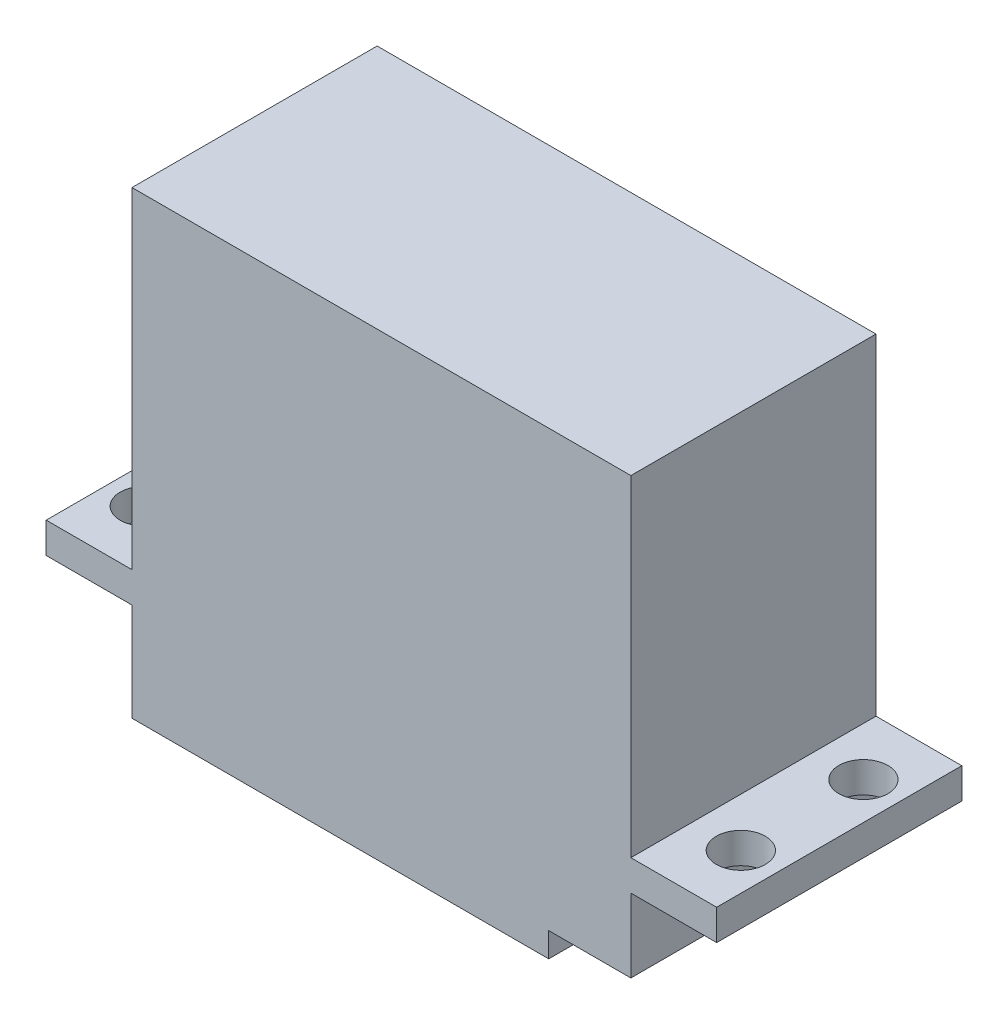
ISO-10303-21;
HEADER;
FILE_DESCRIPTION(('STEP AP214'),'2;1');
FILE_NAME('part.step','',(''),(''),'','','');
FILE_SCHEMA(('AUTOMOTIVE_DESIGN { 1 0 10303 214 1 1 1 1 }'));
ENDSEC;
DATA;
#1=APPLICATION_CONTEXT('core data for automotive mechanical design processes');
#2=APPLICATION_PROTOCOL_DEFINITION('international standard','automotive_design',2000,#1);
#3=PRODUCT_CONTEXT('',#1,'mechanical');
#4=PRODUCT('Part','Part','',(#3));
#5=PRODUCT_RELATED_PRODUCT_CATEGORY('part','',(#4));
#6=PRODUCT_DEFINITION_FORMATION('','',#4);
#7=PRODUCT_DEFINITION_CONTEXT('part definition',#1,'design');
#8=PRODUCT_DEFINITION('design','',#6,#7);
#9=PRODUCT_DEFINITION_SHAPE('','',#8);
#10=(LENGTH_UNIT() NAMED_UNIT(*) SI_UNIT(.MILLI.,.METRE.));
#11=(NAMED_UNIT(*) PLANE_ANGLE_UNIT() SI_UNIT($,.RADIAN.));
#12=(NAMED_UNIT(*) SI_UNIT($,.STERADIAN.) SOLID_ANGLE_UNIT());
#13=UNCERTAINTY_MEASURE_WITH_UNIT(LENGTH_MEASURE(1.E-05),#10,'distance_accuracy_value','');
#14=(GEOMETRIC_REPRESENTATION_CONTEXT(3) GLOBAL_UNCERTAINTY_ASSIGNED_CONTEXT((#13)) GLOBAL_UNIT_ASSIGNED_CONTEXT((#10,
#11,#12)) REPRESENTATION_CONTEXT('',''));
#15=CARTESIAN_POINT('',(0.,0.,0.));
#16=DIRECTION('',(0.,0.,1.));
#17=DIRECTION('',(1.,0.,0.));
#18=AXIS2_PLACEMENT_3D('',#15,#16,#17);
#19=CARTESIAN_POINT('',(-10.3649715284219,-26.3445945945946,10.));
#20=DIRECTION('',(0.,-1.,0.));
#21=DIRECTION('',(0.,0.,-1.));
#22=AXIS2_PLACEMENT_3D('',#19,#20,#21);
#23=PLANE('',#22);
#24=CARTESIAN_POINT('',(-10.3649715284219,-26.3445945945946,10.));
#25=DIRECTION('',(0.,1.,0.));
#26=DIRECTION('',(0.,0.,1.));
#27=AXIS2_PLACEMENT_3D('',#24,#25,#26);
#28=CIRCLE('',#27,2.75);
#29=CARTESIAN_POINT('',(-10.3649715284219,-26.3445945945946,12.75));
#30=VERTEX_POINT('',#29);
#31=EDGE_CURVE('E20',#30,#30,#28,.T.);
#32=ORIENTED_EDGE('',*,*,#31,.F.);
#33=EDGE_LOOP('',(#32));
#34=FACE_BOUND('',#33,.T.);
#35=ADVANCED_FACE('F17',(#34),#23,.T.);
#36=CARTESIAN_POINT('',(-10.3649715284219,-26.3445945945946,10.));
#37=DIRECTION('',(0.,1.,0.));
#38=DIRECTION('',(0.,0.,1.));
#39=AXIS2_PLACEMENT_3D('',#36,#37,#38);
#40=CYLINDRICAL_SURFACE('',#39,2.75);
#41=CARTESIAN_POINT('',(-10.3649715284219,-22.3445945945946,10.));
#42=DIRECTION('',(0.,1.,0.));
#43=DIRECTION('',(0.,0.,1.));
#44=AXIS2_PLACEMENT_3D('',#41,#42,#43);
#45=CIRCLE('',#44,2.75);
#46=CARTESIAN_POINT('',(-10.3649715284219,-22.3445945945946,12.75));
#47=VERTEX_POINT('',#46);
#48=EDGE_CURVE('E194',#47,#47,#45,.T.);
#49=ORIENTED_EDGE('',*,*,#48,.F.);
#50=EDGE_LOOP('',(#49));
#51=FACE_BOUND('',#50,.T.);
#52=ORIENTED_EDGE('',*,*,#31,.T.);
#53=EDGE_LOOP('',(#52));
#54=FACE_BOUND('',#53,.T.);
#55=ADVANCED_FACE('F206',(#51,#54),#40,.T.);
#56=CARTESIAN_POINT('',(-10.3649715284219,-22.3445945945946,10.));
#57=DIRECTION('',(0.,-1.,0.));
#58=DIRECTION('',(0.,0.,-1.));
#59=AXIS2_PLACEMENT_3D('',#56,#57,#58);
#60=PLANE('',#59);
#61=CARTESIAN_POINT('',(-10.3649715284219,-22.3445945945946,10.));
#62=DIRECTION('',(0.,1.,0.));
#63=DIRECTION('',(0.,0.,1.));
#64=AXIS2_PLACEMENT_3D('',#61,#62,#63);
#65=CIRCLE('',#64,6.5);
#66=CARTESIAN_POINT('',(-10.3649715284219,-22.3445945945946,16.5));
#67=VERTEX_POINT('',#66);
#68=EDGE_CURVE('E128',#67,#67,#65,.T.);
#69=ORIENTED_EDGE('',*,*,#68,.F.);
#70=EDGE_LOOP('',(#69));
#71=FACE_BOUND('',#70,.T.);
#72=ORIENTED_EDGE('',*,*,#48,.T.);
#73=EDGE_LOOP('',(#72));
#74=FACE_BOUND('',#73,.T.);
#75=ADVANCED_FACE('F213',(#71,#74),#60,.T.);
#76=CARTESIAN_POINT('',(-24.315,-26.3445945945946,4.99354097072405));
#77=DIRECTION('',(0.,1.,0.));
#78=DIRECTION('',(0.,0.,1.));
#79=AXIS2_PLACEMENT_3D('',#76,#77,#78);
#80=CYLINDRICAL_SURFACE('',#79,2.);
#81=CARTESIAN_POINT('',(-24.315,-12.8445945945946,4.99354097072405));
#82=DIRECTION('',(0.,1.,0.));
#83=DIRECTION('',(0.,0.,1.));
#84=AXIS2_PLACEMENT_3D('',#81,#82,#83);
#85=CIRCLE('',#84,2.);
#86=CARTESIAN_POINT('',(-24.315,-12.8445945945946,6.99354097072405));
#87=VERTEX_POINT('',#86);
#88=EDGE_CURVE('E180',#87,#87,#85,.F.);
#89=ORIENTED_EDGE('',*,*,#88,.T.);
#90=EDGE_LOOP('',(#89));
#91=FACE_BOUND('',#90,.T.);
#92=CARTESIAN_POINT('',(-24.315,-10.3445945945946,4.99354097072405));
#93=DIRECTION('',(0.,1.,0.));
#94=DIRECTION('',(0.,0.,1.));
#95=AXIS2_PLACEMENT_3D('',#92,#93,#94);
#96=CIRCLE('',#95,2.);
#97=CARTESIAN_POINT('',(-24.315,-10.3445945945946,6.99354097072405));
#98=VERTEX_POINT('',#97);
#99=EDGE_CURVE('E137',#98,#98,#96,.T.);
#100=ORIENTED_EDGE('',*,*,#99,.T.);
#101=EDGE_LOOP('',(#100));
#102=FACE_BOUND('',#101,.T.);
#103=ADVANCED_FACE('F291',(#91,#102),#80,.F.);
#104=CARTESIAN_POINT('',(-24.315,-26.3445945945946,14.993540970724));
#105=DIRECTION('',(0.,1.,0.));
#106=DIRECTION('',(0.,0.,1.));
#107=AXIS2_PLACEMENT_3D('',#104,#105,#106);
#108=CYLINDRICAL_SURFACE('',#107,2.00000000000001);
#109=CARTESIAN_POINT('',(-24.315,-12.8445945945946,14.993540970724));
#110=DIRECTION('',(0.,1.,0.));
#111=DIRECTION('',(0.,0.,1.));
#112=AXIS2_PLACEMENT_3D('',#109,#110,#111);
#113=CIRCLE('',#112,2.00000000000001);
#114=CARTESIAN_POINT('',(-24.315,-12.8445945945946,16.9935409707241));
#115=VERTEX_POINT('',#114);
#116=EDGE_CURVE('E175',#115,#115,#113,.F.);
#117=ORIENTED_EDGE('',*,*,#116,.T.);
#118=EDGE_LOOP('',(#117));
#119=FACE_BOUND('',#118,.T.);
#120=CARTESIAN_POINT('',(-24.315,-10.3445945945946,14.993540970724));
#121=DIRECTION('',(0.,1.,0.));
#122=DIRECTION('',(0.,0.,1.));
#123=AXIS2_PLACEMENT_3D('',#120,#121,#122);
#124=CIRCLE('',#123,2.00000000000001);
#125=CARTESIAN_POINT('',(-24.315,-10.3445945945946,16.9935409707241));
#126=VERTEX_POINT('',#125);
#127=EDGE_CURVE('E185',#126,#126,#124,.T.);
#128=ORIENTED_EDGE('',*,*,#127,.T.);
#129=EDGE_LOOP('',(#128));
#130=FACE_BOUND('',#129,.T.);
#131=ADVANCED_FACE('F287',(#119,#130),#108,.F.);
#132=CARTESIAN_POINT('',(-10.3649715284219,-22.3445945945946,10.));
#133=DIRECTION('',(0.,1.,0.));
#134=DIRECTION('',(0.,0.,1.));
#135=AXIS2_PLACEMENT_3D('',#132,#133,#134);
#136=CYLINDRICAL_SURFACE('',#135,6.5);
#137=CARTESIAN_POINT('',(-10.3649715284219,-20.8445945945946,10.));
#138=DIRECTION('',(0.,1.,0.));
#139=DIRECTION('',(0.,0.,1.));
#140=AXIS2_PLACEMENT_3D('',#137,#138,#139);
#141=CIRCLE('',#140,6.5);
#142=CARTESIAN_POINT('',(-10.3649715284219,-20.8445945945946,16.5));
#143=VERTEX_POINT('',#142);
#144=EDGE_CURVE('E169',#143,#143,#141,.T.);
#145=ORIENTED_EDGE('',*,*,#144,.F.);
#146=EDGE_LOOP('',(#145));
#147=FACE_BOUND('',#146,.T.);
#148=ORIENTED_EDGE('',*,*,#68,.T.);
#149=EDGE_LOOP('',(#148));
#150=FACE_BOUND('',#149,.T.);
#151=ADVANCED_FACE('F283',(#147,#150),#136,.T.);
#152=CARTESIAN_POINT('',(24.315,-26.3445945945946,14.993540970724));
#153=DIRECTION('',(0.,1.,0.));
#154=DIRECTION('',(0.,0.,1.));
#155=AXIS2_PLACEMENT_3D('',#152,#153,#154);
#156=CYLINDRICAL_SURFACE('',#155,2.00000000000001);
#157=CARTESIAN_POINT('',(24.315,-12.8445945945946,14.993540970724));
#158=DIRECTION('',(0.,1.,0.));
#159=DIRECTION('',(0.,0.,1.));
#160=AXIS2_PLACEMENT_3D('',#157,#158,#159);
#161=CIRCLE('',#160,2.00000000000001);
#162=CARTESIAN_POINT('',(24.315,-12.8445945945946,16.9935409707241));
#163=VERTEX_POINT('',#162);
#164=EDGE_CURVE('E164',#163,#163,#161,.F.);
#165=ORIENTED_EDGE('',*,*,#164,.T.);
#166=EDGE_LOOP('',(#165));
#167=FACE_BOUND('',#166,.T.);
#168=CARTESIAN_POINT('',(24.315,-10.3445945945946,14.993540970724));
#169=DIRECTION('',(0.,1.,0.));
#170=DIRECTION('',(0.,0.,1.));
#171=AXIS2_PLACEMENT_3D('',#168,#169,#170);
#172=CIRCLE('',#171,2.00000000000001);
#173=CARTESIAN_POINT('',(24.315,-10.3445945945946,16.9935409707241));
#174=VERTEX_POINT('',#173);
#175=EDGE_CURVE('E154',#174,#174,#172,.T.);
#176=ORIENTED_EDGE('',*,*,#175,.T.);
#177=EDGE_LOOP('',(#176));
#178=FACE_BOUND('',#177,.T.);
#179=ADVANCED_FACE('F279',(#167,#178),#156,.F.);
#180=CARTESIAN_POINT('',(24.315,-26.3445945945946,4.99354097072405));
#181=DIRECTION('',(0.,1.,0.));
#182=DIRECTION('',(0.,0.,1.));
#183=AXIS2_PLACEMENT_3D('',#180,#181,#182);
#184=CYLINDRICAL_SURFACE('',#183,2.);
#185=CARTESIAN_POINT('',(24.315,-12.8445945945946,4.99354097072405));
#186=DIRECTION('',(0.,1.,0.));
#187=DIRECTION('',(0.,0.,1.));
#188=AXIS2_PLACEMENT_3D('',#185,#186,#187);
#189=CIRCLE('',#188,2.);
#190=CARTESIAN_POINT('',(24.315,-12.8445945945946,6.99354097072405));
#191=VERTEX_POINT('',#190);
#192=EDGE_CURVE('E159',#191,#191,#189,.F.);
#193=ORIENTED_EDGE('',*,*,#192,.T.);
#194=EDGE_LOOP('',(#193));
#195=FACE_BOUND('',#194,.T.);
#196=CARTESIAN_POINT('',(24.315,-10.3445945945946,4.99354097072405));
#197=DIRECTION('',(0.,1.,0.));
#198=DIRECTION('',(0.,0.,1.));
#199=AXIS2_PLACEMENT_3D('',#196,#197,#198);
#200=CIRCLE('',#199,2.);
#201=CARTESIAN_POINT('',(24.315,-10.3445945945946,6.99354097072405));
#202=VERTEX_POINT('',#201);
#203=EDGE_CURVE('E149',#202,#202,#200,.T.);
#204=ORIENTED_EDGE('',*,*,#203,.T.);
#205=EDGE_LOOP('',(#204));
#206=FACE_BOUND('',#205,.T.);
#207=ADVANCED_FACE('F276',(#195,#206),#184,.F.);
#208=CARTESIAN_POINT('',(0.,0.,20.));
#209=DIRECTION('',(0.,0.,1.));
#210=DIRECTION('',(1.,0.,0.));
#211=AXIS2_PLACEMENT_3D('',#208,#209,#210);
#212=PLANE('',#211);
#213=DIRECTION('',(0.,-1.,0.));
#214=VECTOR('',#213,1.);
#215=CARTESIAN_POINT('',(27.35,-10.3445945945946,20.));
#216=LINE('',#215,#214);
#217=CARTESIAN_POINT('',(27.35,-12.8445945945946,20.));
#218=VERTEX_POINT('',#217);
#219=CARTESIAN_POINT('',(27.35,-10.3445945945946,20.));
#220=VERTEX_POINT('',#219);
#221=EDGE_CURVE('E158',#218,#220,#216,.F.);
#222=ORIENTED_EDGE('',*,*,#221,.T.);
#223=DIRECTION('',(1.,0.,0.));
#224=VECTOR('',#223,1.);
#225=CARTESIAN_POINT('',(20.35,-10.3445945945946,20.));
#226=LINE('',#225,#224);
#227=CARTESIAN_POINT('',(20.35,-10.3445945945946,20.));
#228=VERTEX_POINT('',#227);
#229=EDGE_CURVE('E567',#220,#228,#226,.F.);
#230=ORIENTED_EDGE('',*,*,#229,.T.);
#231=DIRECTION('',(0.,-1.,0.));
#232=VECTOR('',#231,1.);
#233=CARTESIAN_POINT('',(20.35,16.6554054054054,20.));
#234=LINE('',#233,#232);
#235=CARTESIAN_POINT('',(20.35,16.6554054054054,20.));
#236=VERTEX_POINT('',#235);
#237=EDGE_CURVE('E121',#228,#236,#234,.F.);
#238=ORIENTED_EDGE('',*,*,#237,.T.);
#239=DIRECTION('',(1.,0.,0.));
#240=VECTOR('',#239,1.);
#241=CARTESIAN_POINT('',(-20.35,16.6554054054054,20.));
#242=LINE('',#241,#240);
#243=CARTESIAN_POINT('',(-20.35,16.6554054054054,20.));
#244=VERTEX_POINT('',#243);
#245=EDGE_CURVE('E119',#236,#244,#242,.F.);
#246=ORIENTED_EDGE('',*,*,#245,.T.);
#247=DIRECTION('',(0.,1.,0.));
#248=VECTOR('',#247,1.);
#249=CARTESIAN_POINT('',(-20.35,16.6554054054054,20.));
#250=LINE('',#249,#248);
#251=CARTESIAN_POINT('',(-20.35,-10.3445945945946,20.));
#252=VERTEX_POINT('',#251);
#253=EDGE_CURVE('E116',#244,#252,#250,.F.);
#254=ORIENTED_EDGE('',*,*,#253,.T.);
#255=DIRECTION('',(1.,0.,0.));
#256=VECTOR('',#255,1.);
#257=CARTESIAN_POINT('',(-20.35,-10.3445945945946,20.));
#258=LINE('',#257,#256);
#259=CARTESIAN_POINT('',(-27.35,-10.3445945945946,20.));
#260=VERTEX_POINT('',#259);
#261=EDGE_CURVE('E504',#252,#260,#258,.F.);
#262=ORIENTED_EDGE('',*,*,#261,.T.);
#263=DIRECTION('',(0.,1.,0.));
#264=VECTOR('',#263,1.);
#265=CARTESIAN_POINT('',(-27.35,-10.3445945945946,20.));
#266=LINE('',#265,#264);
#267=CARTESIAN_POINT('',(-27.35,-12.8445945945946,20.));
#268=VERTEX_POINT('',#267);
#269=EDGE_CURVE('E184',#260,#268,#266,.F.);
#270=ORIENTED_EDGE('',*,*,#269,.T.);
#271=DIRECTION('',(-1.,0.,0.));
#272=VECTOR('',#271,1.);
#273=CARTESIAN_POINT('',(-27.35,-12.8445945945946,20.));
#274=LINE('',#273,#272);
#275=CARTESIAN_POINT('',(-20.35,-12.8445945945946,20.));
#276=VERTEX_POINT('',#275);
#277=EDGE_CURVE('E612',#268,#276,#274,.F.);
#278=ORIENTED_EDGE('',*,*,#277,.T.);
#279=DIRECTION('',(0.,1.,0.));
#280=VECTOR('',#279,1.);
#281=CARTESIAN_POINT('',(-20.35,-12.8445945945946,20.));
#282=LINE('',#281,#280);
#283=CARTESIAN_POINT('',(-20.35,-20.8445945945946,20.));
#284=VERTEX_POINT('',#283);
#285=EDGE_CURVE('E174',#276,#284,#282,.F.);
#286=ORIENTED_EDGE('',*,*,#285,.T.);
#287=DIRECTION('',(1.,0.,0.));
#288=VECTOR('',#287,1.);
#289=CARTESIAN_POINT('',(0.,-20.8445945945946,20.));
#290=LINE('',#289,#288);
#291=CARTESIAN_POINT('',(13.65,-20.8445945945946,20.));
#292=VERTEX_POINT('',#291);
#293=EDGE_CURVE('E601',#292,#284,#290,.F.);
#294=ORIENTED_EDGE('',*,*,#293,.F.);
#295=DIRECTION('',(0.,-1.,0.));
#296=VECTOR('',#295,1.);
#297=CARTESIAN_POINT('',(13.65,-20.8445945945946,20.));
#298=LINE('',#297,#296);
#299=CARTESIAN_POINT('',(13.65,-18.8445945945946,20.));
#300=VERTEX_POINT('',#299);
#301=EDGE_CURVE('E593',#292,#300,#298,.F.);
#302=ORIENTED_EDGE('',*,*,#301,.T.);
#303=DIRECTION('',(-1.,0.,0.));
#304=VECTOR('',#303,1.);
#305=CARTESIAN_POINT('',(20.35,-18.8445945945946,20.));
#306=LINE('',#305,#304);
#307=CARTESIAN_POINT('',(20.35,-18.8445945945946,20.));
#308=VERTEX_POINT('',#307);
#309=EDGE_CURVE('E590',#300,#308,#306,.F.);
#310=ORIENTED_EDGE('',*,*,#309,.T.);
#311=DIRECTION('',(0.,1.,0.));
#312=VECTOR('',#311,1.);
#313=CARTESIAN_POINT('',(20.35,-12.8445945945946,20.));
#314=LINE('',#313,#312);
#315=CARTESIAN_POINT('',(20.35,-12.8445945945946,20.));
#316=VERTEX_POINT('',#315);
#317=EDGE_CURVE('E168',#308,#316,#314,.T.);
#318=ORIENTED_EDGE('',*,*,#317,.T.);
#319=DIRECTION('',(1.,0.,0.));
#320=VECTOR('',#319,1.);
#321=CARTESIAN_POINT('',(27.35,-12.8445945945946,20.));
#322=LINE('',#321,#320);
#323=EDGE_CURVE('E579',#316,#218,#322,.T.);
#324=ORIENTED_EDGE('',*,*,#323,.T.);
#325=EDGE_LOOP('',(#222,#230,#238,#246,#254,#262,#270,#278,#286,#294,#302,#310,#318,#324));
#326=FACE_BOUND('',#325,.T.);
#327=ADVANCED_FACE('F120',(#326),#212,.T.);
#328=CARTESIAN_POINT('',(-20.35,16.6554054054054,20.));
#329=DIRECTION('',(0.,-1.,0.));
#330=DIRECTION('',(1.,0.,0.));
#331=AXIS2_PLACEMENT_3D('',#328,#329,#330);
#332=PLANE('',#331);
#333=DIRECTION('',(0.,0.,1.));
#334=VECTOR('',#333,1.);
#335=CARTESIAN_POINT('',(-20.35,16.6554054054054,20.));
#336=LINE('',#335,#334);
#337=CARTESIAN_POINT('',(-20.35,16.6554054054054,0.));
#338=VERTEX_POINT('',#337);
#339=EDGE_CURVE('E127',#338,#244,#336,.T.);
#340=ORIENTED_EDGE('',*,*,#339,.T.);
#341=ORIENTED_EDGE('',*,*,#245,.F.);
#342=DIRECTION('',(0.,0.,1.));
#343=VECTOR('',#342,1.);
#344=CARTESIAN_POINT('',(20.35,16.6554054054054,20.));
#345=LINE('',#344,#343);
#346=CARTESIAN_POINT('',(20.35,16.6554054054054,0.));
#347=VERTEX_POINT('',#346);
#348=EDGE_CURVE('E560',#236,#347,#345,.F.);
#349=ORIENTED_EDGE('',*,*,#348,.T.);
#350=DIRECTION('',(1.,0.,0.));
#351=VECTOR('',#350,1.);
#352=CARTESIAN_POINT('',(0.,16.6554054054054,0.));
#353=LINE('',#352,#351);
#354=EDGE_CURVE('E141',#347,#338,#353,.F.);
#355=ORIENTED_EDGE('',*,*,#354,.T.);
#356=EDGE_LOOP('',(#340,#341,#349,#355));
#357=FACE_BOUND('',#356,.T.);
#358=ADVANCED_FACE('F140',(#357),#332,.F.);
#359=CARTESIAN_POINT('',(-20.35,16.6554054054054,20.));
#360=DIRECTION('',(1.,0.,0.));
#361=DIRECTION('',(0.,1.,0.));
#362=AXIS2_PLACEMENT_3D('',#359,#360,#361);
#363=PLANE('',#362);
#364=DIRECTION('',(0.,0.,-1.));
#365=VECTOR('',#364,1.);
#366=CARTESIAN_POINT('',(-20.35,-10.3445945945946,20.));
#367=LINE('',#366,#365);
#368=CARTESIAN_POINT('',(-20.35,-10.3445945945946,0.));
#369=VERTEX_POINT('',#368);
#370=EDGE_CURVE('E135',#369,#252,#367,.F.);
#371=ORIENTED_EDGE('',*,*,#370,.T.);
#372=ORIENTED_EDGE('',*,*,#253,.F.);
#373=ORIENTED_EDGE('',*,*,#339,.F.);
#374=DIRECTION('',(0.,1.,0.));
#375=VECTOR('',#374,1.);
#376=CARTESIAN_POINT('',(-20.35,0.,0.));
#377=LINE('',#376,#375);
#378=EDGE_CURVE('E555',#338,#369,#377,.F.);
#379=ORIENTED_EDGE('',*,*,#378,.T.);
#380=EDGE_LOOP('',(#371,#372,#373,#379));
#381=FACE_BOUND('',#380,.T.);
#382=ADVANCED_FACE('F132',(#381),#363,.F.);
#383=CARTESIAN_POINT('',(-20.35,-10.3445945945946,20.));
#384=DIRECTION('',(0.,-1.,0.));
#385=DIRECTION('',(0.,0.,-1.));
#386=AXIS2_PLACEMENT_3D('',#383,#384,#385);
#387=PLANE('',#386);
#388=DIRECTION('',(0.,0.,1.));
#389=VECTOR('',#388,1.);
#390=CARTESIAN_POINT('',(-27.35,-10.3445945945946,20.));
#391=LINE('',#390,#389);
#392=CARTESIAN_POINT('',(-27.35,-10.3445945945946,0.));
#393=VERTEX_POINT('',#392);
#394=EDGE_CURVE('E503',#393,#260,#391,.T.);
#395=ORIENTED_EDGE('',*,*,#394,.T.);
#396=ORIENTED_EDGE('',*,*,#261,.F.);
#397=ORIENTED_EDGE('',*,*,#370,.F.);
#398=DIRECTION('',(1.,0.,0.));
#399=VECTOR('',#398,1.);
#400=CARTESIAN_POINT('',(0.,-10.3445945945946,0.));
#401=LINE('',#400,#399);
#402=EDGE_CURVE('E506',#369,#393,#401,.F.);
#403=ORIENTED_EDGE('',*,*,#402,.T.);
#404=EDGE_LOOP('',(#395,#396,#397,#403));
#405=FACE_BOUND('',#404,.T.);
#406=ORIENTED_EDGE('',*,*,#127,.F.);
#407=EDGE_LOOP('',(#406));
#408=FACE_BOUND('',#407,.T.);
#409=ORIENTED_EDGE('',*,*,#99,.F.);
#410=EDGE_LOOP('',(#409));
#411=FACE_BOUND('',#410,.T.);
#412=ADVANCED_FACE('F265',(#405,#408,#411),#387,.F.);
#413=CARTESIAN_POINT('',(-27.35,-10.3445945945946,20.));
#414=DIRECTION('',(1.,0.,0.));
#415=DIRECTION('',(0.,1.,0.));
#416=AXIS2_PLACEMENT_3D('',#413,#414,#415);
#417=PLANE('',#416);
#418=DIRECTION('',(0.,0.,1.));
#419=VECTOR('',#418,1.);
#420=CARTESIAN_POINT('',(-27.35,-12.8445945945946,20.));
#421=LINE('',#420,#419);
#422=CARTESIAN_POINT('',(-27.35,-12.8445945945946,0.));
#423=VERTEX_POINT('',#422);
#424=EDGE_CURVE('E179',#423,#268,#421,.T.);
#425=ORIENTED_EDGE('',*,*,#424,.T.);
#426=ORIENTED_EDGE('',*,*,#269,.F.);
#427=ORIENTED_EDGE('',*,*,#394,.F.);
#428=DIRECTION('',(0.,1.,0.));
#429=VECTOR('',#428,1.);
#430=CARTESIAN_POINT('',(-27.35,0.,0.));
#431=LINE('',#430,#429);
#432=EDGE_CURVE('E551',#393,#423,#431,.F.);
#433=ORIENTED_EDGE('',*,*,#432,.T.);
#434=EDGE_LOOP('',(#425,#426,#427,#433));
#435=FACE_BOUND('',#434,.T.);
#436=ADVANCED_FACE('F261',(#435),#417,.F.);
#437=CARTESIAN_POINT('',(-27.35,-12.8445945945946,20.));
#438=DIRECTION('',(0.,1.,0.));
#439=DIRECTION('',(-1.,0.,0.));
#440=AXIS2_PLACEMENT_3D('',#437,#438,#439);
#441=PLANE('',#440);
#442=DIRECTION('',(0.,0.,-1.));
#443=VECTOR('',#442,1.);
#444=CARTESIAN_POINT('',(-20.35,-12.8445945945946,20.));
#445=LINE('',#444,#443);
#446=CARTESIAN_POINT('',(-20.35,-12.8445945945946,0.));
#447=VERTEX_POINT('',#446);
#448=EDGE_CURVE('E609',#447,#276,#445,.F.);
#449=ORIENTED_EDGE('',*,*,#448,.T.);
#450=ORIENTED_EDGE('',*,*,#277,.F.);
#451=ORIENTED_EDGE('',*,*,#424,.F.);
#452=DIRECTION('',(1.,0.,0.));
#453=VECTOR('',#452,1.);
#454=CARTESIAN_POINT('',(0.,-12.8445945945946,0.));
#455=LINE('',#454,#453);
#456=EDGE_CURVE('E547',#423,#447,#455,.T.);
#457=ORIENTED_EDGE('',*,*,#456,.T.);
#458=EDGE_LOOP('',(#449,#450,#451,#457));
#459=FACE_BOUND('',#458,.T.);
#460=ORIENTED_EDGE('',*,*,#116,.F.);
#461=EDGE_LOOP('',(#460));
#462=FACE_BOUND('',#461,.T.);
#463=ORIENTED_EDGE('',*,*,#88,.F.);
#464=EDGE_LOOP('',(#463));
#465=FACE_BOUND('',#464,.T.);
#466=ADVANCED_FACE('F257',(#459,#462,#465),#441,.F.);
#467=CARTESIAN_POINT('',(-20.35,-12.8445945945946,20.));
#468=DIRECTION('',(1.,0.,0.));
#469=DIRECTION('',(0.,0.,-1.));
#470=AXIS2_PLACEMENT_3D('',#467,#468,#469);
#471=PLANE('',#470);
#472=DIRECTION('',(0.,0.,-1.));
#473=VECTOR('',#472,1.);
#474=CARTESIAN_POINT('',(-20.35,-20.8445945945946,0.));
#475=LINE('',#474,#473);
#476=CARTESIAN_POINT('',(-20.35,-20.8445945945946,0.));
#477=VERTEX_POINT('',#476);
#478=EDGE_CURVE('E173',#284,#477,#475,.T.);
#479=ORIENTED_EDGE('',*,*,#478,.F.);
#480=ORIENTED_EDGE('',*,*,#285,.F.);
#481=ORIENTED_EDGE('',*,*,#448,.F.);
#482=DIRECTION('',(0.,1.,0.));
#483=VECTOR('',#482,1.);
#484=CARTESIAN_POINT('',(-20.35,0.,0.));
#485=LINE('',#484,#483);
#486=EDGE_CURVE('E540',#447,#477,#485,.F.);
#487=ORIENTED_EDGE('',*,*,#486,.T.);
#488=EDGE_LOOP('',(#479,#480,#481,#487));
#489=FACE_BOUND('',#488,.T.);
#490=ADVANCED_FACE('F253',(#489),#471,.F.);
#491=CARTESIAN_POINT('',(0.,-20.8445945945946,0.));
#492=DIRECTION('',(0.,-1.,0.));
#493=DIRECTION('',(0.,0.,-1.));
#494=AXIS2_PLACEMENT_3D('',#491,#492,#493);
#495=PLANE('',#494);
#496=DIRECTION('',(0.,0.,1.));
#497=VECTOR('',#496,1.);
#498=CARTESIAN_POINT('',(13.65,-20.8445945945946,20.));
#499=LINE('',#498,#497);
#500=CARTESIAN_POINT('',(13.65,-20.8445945945946,0.));
#501=VERTEX_POINT('',#500);
#502=EDGE_CURVE('E597',#501,#292,#499,.T.);
#503=ORIENTED_EDGE('',*,*,#502,.T.);
#504=ORIENTED_EDGE('',*,*,#293,.T.);
#505=ORIENTED_EDGE('',*,*,#478,.T.);
#506=DIRECTION('',(1.,0.,0.));
#507=VECTOR('',#506,1.);
#508=CARTESIAN_POINT('',(0.,-20.8445945945946,0.));
#509=LINE('',#508,#507);
#510=EDGE_CURVE('E531',#477,#501,#509,.T.);
#511=ORIENTED_EDGE('',*,*,#510,.T.);
#512=EDGE_LOOP('',(#503,#504,#505,#511));
#513=FACE_BOUND('',#512,.T.);
#514=ORIENTED_EDGE('',*,*,#144,.T.);
#515=EDGE_LOOP('',(#514));
#516=FACE_BOUND('',#515,.T.);
#517=ADVANCED_FACE('F249',(#513,#516),#495,.T.);
#518=CARTESIAN_POINT('',(13.65,-20.8445945945946,20.));
#519=DIRECTION('',(-1.,0.,0.));
#520=DIRECTION('',(0.,-1.,0.));
#521=AXIS2_PLACEMENT_3D('',#518,#519,#520);
#522=PLANE('',#521);
#523=ORIENTED_EDGE('',*,*,#301,.F.);
#524=ORIENTED_EDGE('',*,*,#502,.F.);
#525=DIRECTION('',(0.,1.,0.));
#526=VECTOR('',#525,1.);
#527=CARTESIAN_POINT('',(13.65,0.,0.));
#528=LINE('',#527,#526);
#529=CARTESIAN_POINT('',(13.65,-18.8445945945946,0.));
#530=VERTEX_POINT('',#529);
#531=EDGE_CURVE('E528',#501,#530,#528,.T.);
#532=ORIENTED_EDGE('',*,*,#531,.T.);
#533=DIRECTION('',(0.,0.,1.));
#534=VECTOR('',#533,1.);
#535=CARTESIAN_POINT('',(13.65,-18.8445945945946,20.));
#536=LINE('',#535,#534);
#537=EDGE_CURVE('E521',#530,#300,#536,.T.);
#538=ORIENTED_EDGE('',*,*,#537,.T.);
#539=EDGE_LOOP('',(#523,#524,#532,#538));
#540=FACE_BOUND('',#539,.T.);
#541=ADVANCED_FACE('F245',(#540),#522,.F.);
#542=CARTESIAN_POINT('',(20.35,-18.8445945945946,20.));
#543=DIRECTION('',(0.,1.,0.));
#544=DIRECTION('',(-1.,0.,0.));
#545=AXIS2_PLACEMENT_3D('',#542,#543,#544);
#546=PLANE('',#545);
#547=DIRECTION('',(1.,0.,0.));
#548=VECTOR('',#547,1.);
#549=CARTESIAN_POINT('',(0.,-18.8445945945946,0.));
#550=LINE('',#549,#548);
#551=CARTESIAN_POINT('',(20.35,-18.8445945945946,0.));
#552=VERTEX_POINT('',#551);
#553=EDGE_CURVE('E530',#530,#552,#550,.T.);
#554=ORIENTED_EDGE('',*,*,#553,.T.);
#555=DIRECTION('',(0.,0.,1.));
#556=VECTOR('',#555,1.);
#557=CARTESIAN_POINT('',(20.35,-18.8445945945946,20.));
#558=LINE('',#557,#556);
#559=EDGE_CURVE('E585',#552,#308,#558,.T.);
#560=ORIENTED_EDGE('',*,*,#559,.T.);
#561=ORIENTED_EDGE('',*,*,#309,.F.);
#562=ORIENTED_EDGE('',*,*,#537,.F.);
#563=EDGE_LOOP('',(#554,#560,#561,#562));
#564=FACE_BOUND('',#563,.T.);
#565=ADVANCED_FACE('F241',(#564),#546,.F.);
#566=CARTESIAN_POINT('',(20.35,-12.8445945945946,20.));
#567=DIRECTION('',(-1.,0.,0.));
#568=DIRECTION('',(0.,0.,1.));
#569=AXIS2_PLACEMENT_3D('',#566,#567,#568);
#570=PLANE('',#569);
#571=DIRECTION('',(0.,0.,1.));
#572=VECTOR('',#571,1.);
#573=CARTESIAN_POINT('',(20.35,-12.8445945945946,20.));
#574=LINE('',#573,#572);
#575=CARTESIAN_POINT('',(20.35,-12.8445945945946,0.));
#576=VERTEX_POINT('',#575);
#577=EDGE_CURVE('E163',#576,#316,#574,.T.);
#578=ORIENTED_EDGE('',*,*,#577,.T.);
#579=ORIENTED_EDGE('',*,*,#317,.F.);
#580=ORIENTED_EDGE('',*,*,#559,.F.);
#581=DIRECTION('',(0.,1.,0.));
#582=VECTOR('',#581,1.);
#583=CARTESIAN_POINT('',(20.35,0.,0.));
#584=LINE('',#583,#582);
#585=EDGE_CURVE('E526',#552,#576,#584,.T.);
#586=ORIENTED_EDGE('',*,*,#585,.T.);
#587=EDGE_LOOP('',(#578,#579,#580,#586));
#588=FACE_BOUND('',#587,.T.);
#589=ADVANCED_FACE('F237',(#588),#570,.F.);
#590=CARTESIAN_POINT('',(27.35,-12.8445945945946,20.));
#591=DIRECTION('',(0.,1.,0.));
#592=DIRECTION('',(0.,0.,1.));
#593=AXIS2_PLACEMENT_3D('',#590,#591,#592);
#594=PLANE('',#593);
#595=DIRECTION('',(0.,0.,1.));
#596=VECTOR('',#595,1.);
#597=CARTESIAN_POINT('',(27.35,-12.8445945945946,20.));
#598=LINE('',#597,#596);
#599=CARTESIAN_POINT('',(27.35,-12.8445945945946,0.));
#600=VERTEX_POINT('',#599);
#601=EDGE_CURVE('E575',#600,#218,#598,.T.);
#602=ORIENTED_EDGE('',*,*,#601,.T.);
#603=ORIENTED_EDGE('',*,*,#323,.F.);
#604=ORIENTED_EDGE('',*,*,#577,.F.);
#605=DIRECTION('',(1.,0.,0.));
#606=VECTOR('',#605,1.);
#607=CARTESIAN_POINT('',(0.,-12.8445945945946,0.));
#608=LINE('',#607,#606);
#609=EDGE_CURVE('E523',#576,#600,#608,.T.);
#610=ORIENTED_EDGE('',*,*,#609,.T.);
#611=EDGE_LOOP('',(#602,#603,#604,#610));
#612=FACE_BOUND('',#611,.T.);
#613=ORIENTED_EDGE('',*,*,#192,.F.);
#614=EDGE_LOOP('',(#613));
#615=FACE_BOUND('',#614,.T.);
#616=ORIENTED_EDGE('',*,*,#164,.F.);
#617=EDGE_LOOP('',(#616));
#618=FACE_BOUND('',#617,.T.);
#619=ADVANCED_FACE('F233',(#612,#615,#618),#594,.F.);
#620=CARTESIAN_POINT('',(27.35,-10.3445945945946,20.));
#621=DIRECTION('',(-1.,0.,0.));
#622=DIRECTION('',(0.,-1.,0.));
#623=AXIS2_PLACEMENT_3D('',#620,#621,#622);
#624=PLANE('',#623);
#625=DIRECTION('',(0.,0.,1.));
#626=VECTOR('',#625,1.);
#627=CARTESIAN_POINT('',(27.35,-10.3445945945946,20.));
#628=LINE('',#627,#626);
#629=CARTESIAN_POINT('',(27.35,-10.3445945945946,0.));
#630=VERTEX_POINT('',#629);
#631=EDGE_CURVE('E153',#630,#220,#628,.T.);
#632=ORIENTED_EDGE('',*,*,#631,.T.);
#633=ORIENTED_EDGE('',*,*,#221,.F.);
#634=ORIENTED_EDGE('',*,*,#601,.F.);
#635=DIRECTION('',(0.,1.,0.));
#636=VECTOR('',#635,1.);
#637=CARTESIAN_POINT('',(27.35,0.,0.));
#638=LINE('',#637,#636);
#639=EDGE_CURVE('E525',#600,#630,#638,.T.);
#640=ORIENTED_EDGE('',*,*,#639,.T.);
#641=EDGE_LOOP('',(#632,#633,#634,#640));
#642=FACE_BOUND('',#641,.T.);
#643=ADVANCED_FACE('F229',(#642),#624,.F.);
#644=CARTESIAN_POINT('',(20.35,-10.3445945945946,20.));
#645=DIRECTION('',(0.,-1.,0.));
#646=DIRECTION('',(1.,0.,0.));
#647=AXIS2_PLACEMENT_3D('',#644,#645,#646);
#648=PLANE('',#647);
#649=DIRECTION('',(0.,0.,1.));
#650=VECTOR('',#649,1.);
#651=CARTESIAN_POINT('',(20.35,-10.3445945945946,20.));
#652=LINE('',#651,#650);
#653=CARTESIAN_POINT('',(20.35,-10.3445945945946,0.));
#654=VERTEX_POINT('',#653);
#655=EDGE_CURVE('E35',#654,#228,#652,.T.);
#656=ORIENTED_EDGE('',*,*,#655,.T.);
#657=ORIENTED_EDGE('',*,*,#229,.F.);
#658=ORIENTED_EDGE('',*,*,#631,.F.);
#659=DIRECTION('',(1.,0.,0.));
#660=VECTOR('',#659,1.);
#661=CARTESIAN_POINT('',(0.,-10.3445945945946,0.));
#662=LINE('',#661,#660);
#663=EDGE_CURVE('E27',#630,#654,#662,.F.);
#664=ORIENTED_EDGE('',*,*,#663,.T.);
#665=EDGE_LOOP('',(#656,#657,#658,#664));
#666=FACE_BOUND('',#665,.T.);
#667=ORIENTED_EDGE('',*,*,#203,.F.);
#668=EDGE_LOOP('',(#667));
#669=FACE_BOUND('',#668,.T.);
#670=ORIENTED_EDGE('',*,*,#175,.F.);
#671=EDGE_LOOP('',(#670));
#672=FACE_BOUND('',#671,.T.);
#673=ADVANCED_FACE('F223',(#666,#669,#672),#648,.F.);
#674=CARTESIAN_POINT('',(20.35,16.6554054054054,20.));
#675=DIRECTION('',(-1.,0.,0.));
#676=DIRECTION('',(0.,-1.,0.));
#677=AXIS2_PLACEMENT_3D('',#674,#675,#676);
#678=PLANE('',#677);
#679=ORIENTED_EDGE('',*,*,#348,.F.);
#680=ORIENTED_EDGE('',*,*,#237,.F.);
#681=ORIENTED_EDGE('',*,*,#655,.F.);
#682=DIRECTION('',(0.,1.,0.));
#683=VECTOR('',#682,1.);
#684=CARTESIAN_POINT('',(20.35,0.,0.));
#685=LINE('',#684,#683);
#686=EDGE_CURVE('E11',#654,#347,#685,.T.);
#687=ORIENTED_EDGE('',*,*,#686,.T.);
#688=EDGE_LOOP('',(#679,#680,#681,#687));
#689=FACE_BOUND('',#688,.T.);
#690=ADVANCED_FACE('F217',(#689),#678,.F.);
#691=CARTESIAN_POINT('',(0.,0.,0.));
#692=DIRECTION('',(0.,0.,1.));
#693=DIRECTION('',(1.,0.,0.));
#694=AXIS2_PLACEMENT_3D('',#691,#692,#693);
#695=PLANE('',#694);
#696=ORIENTED_EDGE('',*,*,#663,.F.);
#697=ORIENTED_EDGE('',*,*,#639,.F.);
#698=ORIENTED_EDGE('',*,*,#609,.F.);
#699=ORIENTED_EDGE('',*,*,#585,.F.);
#700=ORIENTED_EDGE('',*,*,#553,.F.);
#701=ORIENTED_EDGE('',*,*,#531,.F.);
#702=ORIENTED_EDGE('',*,*,#510,.F.);
#703=ORIENTED_EDGE('',*,*,#486,.F.);
#704=ORIENTED_EDGE('',*,*,#456,.F.);
#705=ORIENTED_EDGE('',*,*,#432,.F.);
#706=ORIENTED_EDGE('',*,*,#402,.F.);
#707=ORIENTED_EDGE('',*,*,#378,.F.);
#708=ORIENTED_EDGE('',*,*,#354,.F.);
#709=ORIENTED_EDGE('',*,*,#686,.F.);
#710=EDGE_LOOP('',(#696,#697,#698,#699,#700,#701,#702,#703,#704,#705,#706,#707,#708,#709));
#711=FACE_BOUND('',#710,.T.);
#712=ADVANCED_FACE('F215',(#711),#695,.F.);
#713=CLOSED_SHELL('',(#35,#55,#75,#103,#131,#151,#179,#207,#327,#358,#382,#412,#436,#466,#490,
#517,#541,#565,#589,#619,#643,#673,#690,#712));
#714=MANIFOLD_SOLID_BREP('B1',#713);
#715=ADVANCED_BREP_SHAPE_REPRESENTATION('',(#18,#714),#14);
#716=SHAPE_DEFINITION_REPRESENTATION(#9,#715);
ENDSEC;
END-ISO-10303-21;
